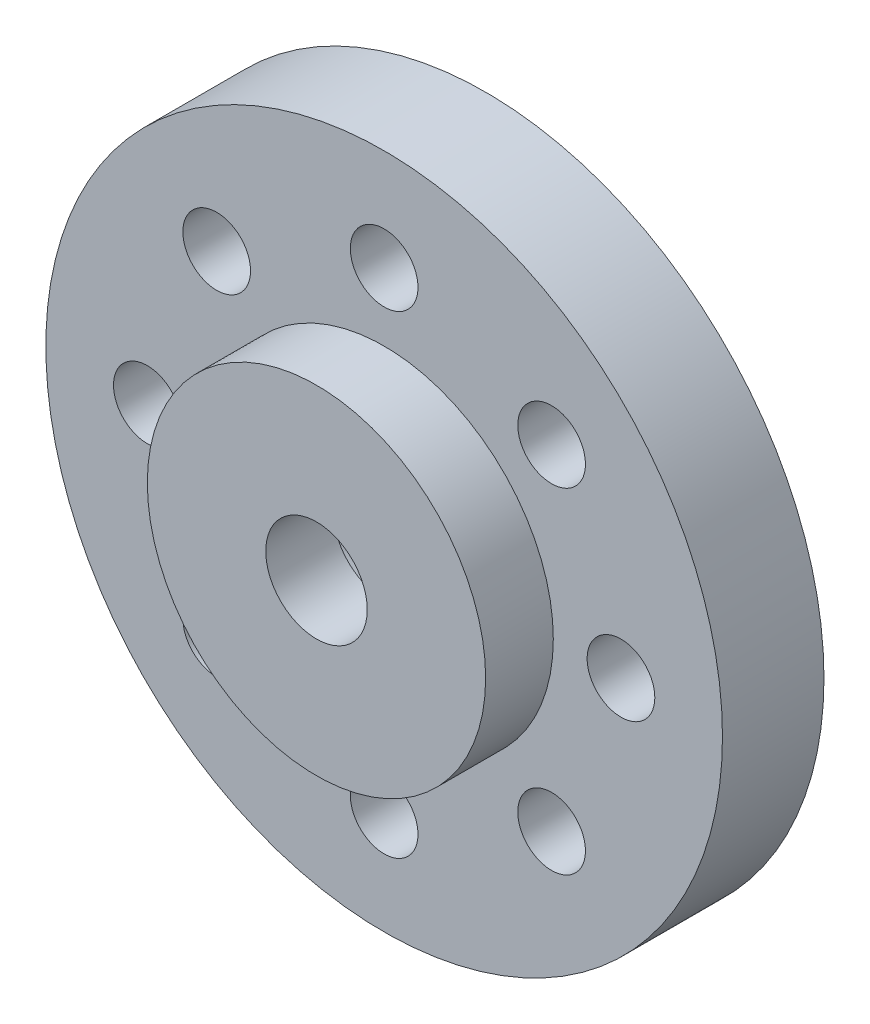
ISO-10303-21;
HEADER;
FILE_DESCRIPTION(('STEP AP214'),'2;1');
FILE_NAME('part.step','',(''),(''),'','','');
FILE_SCHEMA(('AUTOMOTIVE_DESIGN { 1 0 10303 214 1 1 1 1 }'));
ENDSEC;
DATA;
#1=APPLICATION_CONTEXT('core data for automotive mechanical design processes');
#2=APPLICATION_PROTOCOL_DEFINITION('international standard','automotive_design',2000,#1);
#3=PRODUCT_CONTEXT('',#1,'mechanical');
#4=PRODUCT('Part','Part','',(#3));
#5=PRODUCT_RELATED_PRODUCT_CATEGORY('part','',(#4));
#6=PRODUCT_DEFINITION_FORMATION('','',#4);
#7=PRODUCT_DEFINITION_CONTEXT('part definition',#1,'design');
#8=PRODUCT_DEFINITION('design','',#6,#7);
#9=PRODUCT_DEFINITION_SHAPE('','',#8);
#10=(LENGTH_UNIT() NAMED_UNIT(*) SI_UNIT(.MILLI.,.METRE.));
#11=(NAMED_UNIT(*) PLANE_ANGLE_UNIT() SI_UNIT($,.RADIAN.));
#12=(NAMED_UNIT(*) SI_UNIT($,.STERADIAN.) SOLID_ANGLE_UNIT());
#13=UNCERTAINTY_MEASURE_WITH_UNIT(LENGTH_MEASURE(1.E-05),#10,'distance_accuracy_value','');
#14=(GEOMETRIC_REPRESENTATION_CONTEXT(3) GLOBAL_UNCERTAINTY_ASSIGNED_CONTEXT((#13)) GLOBAL_UNIT_ASSIGNED_CONTEXT((#10,
#11,#12)) REPRESENTATION_CONTEXT('',''));
#15=CARTESIAN_POINT('',(0.,0.,0.));
#16=DIRECTION('',(0.,0.,1.));
#17=DIRECTION('',(1.,0.,0.));
#18=AXIS2_PLACEMENT_3D('',#15,#16,#17);
#19=CARTESIAN_POINT('',(0.,0.,3.));
#20=DIRECTION('',(0.,0.,1.));
#21=DIRECTION('',(1.,0.,0.));
#22=AXIS2_PLACEMENT_3D('',#19,#20,#21);
#23=PLANE('',#22);
#24=CARTESIAN_POINT('',(0.,0.,3.));
#25=DIRECTION('',(0.,0.,1.));
#26=DIRECTION('',(1.,0.,0.));
#27=AXIS2_PLACEMENT_3D('',#24,#25,#26);
#28=CIRCLE('',#27,5.);
#29=CARTESIAN_POINT('',(5.,0.,3.));
#30=VERTEX_POINT('',#29);
#31=EDGE_CURVE('E126',#30,#30,#28,.T.);
#32=ORIENTED_EDGE('',*,*,#31,.F.);
#33=EDGE_LOOP('',(#32));
#34=FACE_BOUND('',#33,.T.);
#35=CARTESIAN_POINT('',(0.,7.,3.));
#36=DIRECTION('',(0.,0.,1.));
#37=DIRECTION('',(1.,0.,0.));
#38=AXIS2_PLACEMENT_3D('',#35,#36,#37);
#39=CIRCLE('',#38,1.);
#40=CARTESIAN_POINT('',(1.00000000000007,7.,3.));
#41=VERTEX_POINT('',#40);
#42=EDGE_CURVE('E102',#41,#41,#39,.T.);
#43=ORIENTED_EDGE('',*,*,#42,.F.);
#44=EDGE_LOOP('',(#43));
#45=FACE_BOUND('',#44,.T.);
#46=CARTESIAN_POINT('',(-7.,0.,3.));
#47=DIRECTION('',(0.,0.,1.));
#48=DIRECTION('',(1.,0.,0.));
#49=AXIS2_PLACEMENT_3D('',#46,#47,#48);
#50=CIRCLE('',#49,1.);
#51=CARTESIAN_POINT('',(-6.,0.,3.));
#52=VERTEX_POINT('',#51);
#53=EDGE_CURVE('E86',#52,#52,#50,.T.);
#54=ORIENTED_EDGE('',*,*,#53,.F.);
#55=EDGE_LOOP('',(#54));
#56=FACE_BOUND('',#55,.T.);
#57=CARTESIAN_POINT('',(0.,-7.,3.));
#58=DIRECTION('',(0.,0.,1.));
#59=DIRECTION('',(1.,0.,0.));
#60=AXIS2_PLACEMENT_3D('',#57,#58,#59);
#61=CIRCLE('',#60,1.);
#62=CARTESIAN_POINT('',(0.999999999999977,-7.,3.));
#63=VERTEX_POINT('',#62);
#64=EDGE_CURVE('E70',#63,#63,#61,.T.);
#65=ORIENTED_EDGE('',*,*,#64,.F.);
#66=EDGE_LOOP('',(#65));
#67=FACE_BOUND('',#66,.T.);
#68=CARTESIAN_POINT('',(7.,0.,3.));
#69=DIRECTION('',(0.,0.,1.));
#70=DIRECTION('',(1.,0.,0.));
#71=AXIS2_PLACEMENT_3D('',#68,#69,#70);
#72=CIRCLE('',#71,1.);
#73=CARTESIAN_POINT('',(8.,0.,3.));
#74=VERTEX_POINT('',#73);
#75=EDGE_CURVE('E57',#74,#74,#72,.T.);
#76=ORIENTED_EDGE('',*,*,#75,.F.);
#77=EDGE_LOOP('',(#76));
#78=FACE_BOUND('',#77,.T.);
#79=CARTESIAN_POINT('',(0.,0.,3.));
#80=DIRECTION('',(0.,0.,1.));
#81=DIRECTION('',(1.,0.,0.));
#82=AXIS2_PLACEMENT_3D('',#79,#80,#81);
#83=CIRCLE('',#82,10.);
#84=CARTESIAN_POINT('',(10.,0.,3.));
#85=VERTEX_POINT('',#84);
#86=EDGE_CURVE('E10',#85,#85,#83,.T.);
#87=ORIENTED_EDGE('',*,*,#86,.T.);
#88=EDGE_LOOP('',(#87));
#89=FACE_BOUND('',#88,.T.);
#90=CARTESIAN_POINT('',(4.94974746830583,-4.94974746830584,3.));
#91=DIRECTION('',(0.,0.,1.));
#92=DIRECTION('',(1.,0.,0.));
#93=AXIS2_PLACEMENT_3D('',#90,#91,#92);
#94=CIRCLE('',#93,1.);
#95=CARTESIAN_POINT('',(5.94974746830583,-4.94974746830584,3.));
#96=VERTEX_POINT('',#95);
#97=EDGE_CURVE('E62',#96,#96,#94,.T.);
#98=ORIENTED_EDGE('',*,*,#97,.F.);
#99=EDGE_LOOP('',(#98));
#100=FACE_BOUND('',#99,.T.);
#101=CARTESIAN_POINT('',(-4.94974746830586,-4.94974746830581,3.));
#102=DIRECTION('',(0.,0.,1.));
#103=DIRECTION('',(1.,0.,0.));
#104=AXIS2_PLACEMENT_3D('',#101,#102,#103);
#105=CIRCLE('',#104,1.);
#106=CARTESIAN_POINT('',(-3.94974746830586,-4.94974746830581,3.));
#107=VERTEX_POINT('',#106);
#108=EDGE_CURVE('E78',#107,#107,#105,.T.);
#109=ORIENTED_EDGE('',*,*,#108,.F.);
#110=EDGE_LOOP('',(#109));
#111=FACE_BOUND('',#110,.T.);
#112=CARTESIAN_POINT('',(-4.94974746830579,4.94974746830588,3.));
#113=DIRECTION('',(0.,0.,1.));
#114=DIRECTION('',(1.,0.,0.));
#115=AXIS2_PLACEMENT_3D('',#112,#113,#114);
#116=CIRCLE('',#115,1.);
#117=CARTESIAN_POINT('',(-3.94974746830579,4.94974746830588,3.));
#118=VERTEX_POINT('',#117);
#119=EDGE_CURVE('E94',#118,#118,#116,.T.);
#120=ORIENTED_EDGE('',*,*,#119,.F.);
#121=EDGE_LOOP('',(#120));
#122=FACE_BOUND('',#121,.T.);
#123=CARTESIAN_POINT('',(4.94974746830589,4.94974746830577,3.));
#124=DIRECTION('',(0.,0.,1.));
#125=DIRECTION('',(1.,0.,0.));
#126=AXIS2_PLACEMENT_3D('',#123,#124,#125);
#127=CIRCLE('',#126,1.);
#128=CARTESIAN_POINT('',(5.94974746830589,4.94974746830577,3.));
#129=VERTEX_POINT('',#128);
#130=EDGE_CURVE('E110',#129,#129,#127,.T.);
#131=ORIENTED_EDGE('',*,*,#130,.F.);
#132=EDGE_LOOP('',(#131));
#133=FACE_BOUND('',#132,.T.);
#134=ADVANCED_FACE('F39',(#34,#45,#56,#67,#78,#89,#100,#111,#122,#133),#23,.T.);
#135=CARTESIAN_POINT('',(0.,0.,0.));
#136=DIRECTION('',(0.,0.,1.));
#137=DIRECTION('',(1.,0.,0.));
#138=AXIS2_PLACEMENT_3D('',#135,#136,#137);
#139=PLANE('',#138);
#140=CARTESIAN_POINT('',(0.,0.,0.));
#141=DIRECTION('',(0.,0.,1.));
#142=DIRECTION('',(1.,0.,0.));
#143=AXIS2_PLACEMENT_3D('',#140,#141,#142);
#144=CIRCLE('',#143,10.);
#145=CARTESIAN_POINT('',(10.,0.,0.));
#146=VERTEX_POINT('',#145);
#147=EDGE_CURVE('E43',#146,#146,#144,.T.);
#148=ORIENTED_EDGE('',*,*,#147,.F.);
#149=EDGE_LOOP('',(#148));
#150=FACE_BOUND('',#149,.T.);
#151=CARTESIAN_POINT('',(0.,0.,0.));
#152=DIRECTION('',(0.,0.,1.));
#153=DIRECTION('',(1.,0.,0.));
#154=AXIS2_PLACEMENT_3D('',#151,#152,#153);
#155=CIRCLE('',#154,3.);
#156=CARTESIAN_POINT('',(3.,0.,0.));
#157=VERTEX_POINT('',#156);
#158=EDGE_CURVE('E52',#157,#157,#155,.T.);
#159=ORIENTED_EDGE('',*,*,#158,.T.);
#160=EDGE_LOOP('',(#159));
#161=FACE_BOUND('',#160,.T.);
#162=CARTESIAN_POINT('',(7.,0.,0.));
#163=DIRECTION('',(0.,0.,1.));
#164=DIRECTION('',(1.,0.,0.));
#165=AXIS2_PLACEMENT_3D('',#162,#163,#164);
#166=CIRCLE('',#165,1.);
#167=CARTESIAN_POINT('',(8.,0.,0.));
#168=VERTEX_POINT('',#167);
#169=EDGE_CURVE('E58',#168,#168,#166,.T.);
#170=ORIENTED_EDGE('',*,*,#169,.T.);
#171=EDGE_LOOP('',(#170));
#172=FACE_BOUND('',#171,.T.);
#173=CARTESIAN_POINT('',(4.94974746830583,-4.94974746830584,0.));
#174=DIRECTION('',(0.,0.,1.));
#175=DIRECTION('',(1.,0.,0.));
#176=AXIS2_PLACEMENT_3D('',#173,#174,#175);
#177=CIRCLE('',#176,1.);
#178=CARTESIAN_POINT('',(5.94974746830583,-4.94974746830584,0.));
#179=VERTEX_POINT('',#178);
#180=EDGE_CURVE('E66',#179,#179,#177,.T.);
#181=ORIENTED_EDGE('',*,*,#180,.T.);
#182=EDGE_LOOP('',(#181));
#183=FACE_BOUND('',#182,.T.);
#184=CARTESIAN_POINT('',(0.,-7.,0.));
#185=DIRECTION('',(0.,0.,1.));
#186=DIRECTION('',(1.,0.,0.));
#187=AXIS2_PLACEMENT_3D('',#184,#185,#186);
#188=CIRCLE('',#187,1.);
#189=CARTESIAN_POINT('',(0.999999999999977,-7.,0.));
#190=VERTEX_POINT('',#189);
#191=EDGE_CURVE('E74',#190,#190,#188,.T.);
#192=ORIENTED_EDGE('',*,*,#191,.T.);
#193=EDGE_LOOP('',(#192));
#194=FACE_BOUND('',#193,.T.);
#195=CARTESIAN_POINT('',(-4.94974746830586,-4.94974746830581,0.));
#196=DIRECTION('',(0.,0.,1.));
#197=DIRECTION('',(1.,0.,0.));
#198=AXIS2_PLACEMENT_3D('',#195,#196,#197);
#199=CIRCLE('',#198,1.);
#200=CARTESIAN_POINT('',(-3.94974746830586,-4.94974746830581,0.));
#201=VERTEX_POINT('',#200);
#202=EDGE_CURVE('E82',#201,#201,#199,.T.);
#203=ORIENTED_EDGE('',*,*,#202,.T.);
#204=EDGE_LOOP('',(#203));
#205=FACE_BOUND('',#204,.T.);
#206=CARTESIAN_POINT('',(-7.,0.,0.));
#207=DIRECTION('',(0.,0.,1.));
#208=DIRECTION('',(1.,0.,0.));
#209=AXIS2_PLACEMENT_3D('',#206,#207,#208);
#210=CIRCLE('',#209,1.);
#211=CARTESIAN_POINT('',(-6.,0.,0.));
#212=VERTEX_POINT('',#211);
#213=EDGE_CURVE('E90',#212,#212,#210,.T.);
#214=ORIENTED_EDGE('',*,*,#213,.T.);
#215=EDGE_LOOP('',(#214));
#216=FACE_BOUND('',#215,.T.);
#217=CARTESIAN_POINT('',(-4.94974746830579,4.94974746830588,0.));
#218=DIRECTION('',(0.,0.,1.));
#219=DIRECTION('',(1.,0.,0.));
#220=AXIS2_PLACEMENT_3D('',#217,#218,#219);
#221=CIRCLE('',#220,1.);
#222=CARTESIAN_POINT('',(-3.94974746830579,4.94974746830588,0.));
#223=VERTEX_POINT('',#222);
#224=EDGE_CURVE('E98',#223,#223,#221,.T.);
#225=ORIENTED_EDGE('',*,*,#224,.T.);
#226=EDGE_LOOP('',(#225));
#227=FACE_BOUND('',#226,.T.);
#228=CARTESIAN_POINT('',(0.,7.,0.));
#229=DIRECTION('',(0.,0.,1.));
#230=DIRECTION('',(1.,0.,0.));
#231=AXIS2_PLACEMENT_3D('',#228,#229,#230);
#232=CIRCLE('',#231,1.);
#233=CARTESIAN_POINT('',(1.00000000000007,7.,0.));
#234=VERTEX_POINT('',#233);
#235=EDGE_CURVE('E106',#234,#234,#232,.T.);
#236=ORIENTED_EDGE('',*,*,#235,.T.);
#237=EDGE_LOOP('',(#236));
#238=FACE_BOUND('',#237,.T.);
#239=CARTESIAN_POINT('',(4.94974746830589,4.94974746830577,0.));
#240=DIRECTION('',(0.,0.,1.));
#241=DIRECTION('',(1.,0.,0.));
#242=AXIS2_PLACEMENT_3D('',#239,#240,#241);
#243=CIRCLE('',#242,1.);
#244=CARTESIAN_POINT('',(5.94974746830589,4.94974746830577,0.));
#245=VERTEX_POINT('',#244);
#246=EDGE_CURVE('E114',#245,#245,#243,.T.);
#247=ORIENTED_EDGE('',*,*,#246,.T.);
#248=EDGE_LOOP('',(#247));
#249=FACE_BOUND('',#248,.T.);
#250=ADVANCED_FACE('F162',(#150,#161,#172,#183,#194,#205,#216,#227,#238,#249),#139,.F.);
#251=CARTESIAN_POINT('',(0.,0.,3.));
#252=DIRECTION('',(0.,0.,-1.));
#253=DIRECTION('',(-1.,0.,0.));
#254=AXIS2_PLACEMENT_3D('',#251,#252,#253);
#255=CYLINDRICAL_SURFACE('',#254,10.);
#256=ORIENTED_EDGE('',*,*,#86,.F.);
#257=EDGE_LOOP('',(#256));
#258=FACE_BOUND('',#257,.T.);
#259=ORIENTED_EDGE('',*,*,#147,.T.);
#260=EDGE_LOOP('',(#259));
#261=FACE_BOUND('',#260,.T.);
#262=ADVANCED_FACE('F41',(#258,#261),#255,.T.);
#263=CARTESIAN_POINT('',(0.,0.,3.));
#264=DIRECTION('',(0.,0.,-1.));
#265=DIRECTION('',(-1.,0.,0.));
#266=AXIS2_PLACEMENT_3D('',#263,#264,#265);
#267=CYLINDRICAL_SURFACE('',#266,3.);
#268=CARTESIAN_POINT('',(0.,0.,3.));
#269=DIRECTION('',(0.,0.,1.));
#270=DIRECTION('',(1.,0.,0.));
#271=AXIS2_PLACEMENT_3D('',#268,#269,#270);
#272=CIRCLE('',#271,3.);
#273=CARTESIAN_POINT('',(3.,0.,3.));
#274=VERTEX_POINT('',#273);
#275=EDGE_CURVE('E118',#274,#274,#272,.T.);
#276=ORIENTED_EDGE('',*,*,#275,.T.);
#277=EDGE_LOOP('',(#276));
#278=FACE_BOUND('',#277,.T.);
#279=ORIENTED_EDGE('',*,*,#158,.F.);
#280=EDGE_LOOP('',(#279));
#281=FACE_BOUND('',#280,.T.);
#282=ADVANCED_FACE('F172',(#278,#281),#267,.F.);
#283=CARTESIAN_POINT('',(7.,0.,3.));
#284=DIRECTION('',(0.,0.,-1.));
#285=DIRECTION('',(-1.,0.,0.));
#286=AXIS2_PLACEMENT_3D('',#283,#284,#285);
#287=CYLINDRICAL_SURFACE('',#286,1.);
#288=ORIENTED_EDGE('',*,*,#75,.T.);
#289=EDGE_LOOP('',(#288));
#290=FACE_BOUND('',#289,.T.);
#291=ORIENTED_EDGE('',*,*,#169,.F.);
#292=EDGE_LOOP('',(#291));
#293=FACE_BOUND('',#292,.T.);
#294=ADVANCED_FACE('F175',(#290,#293),#287,.F.);
#295=CARTESIAN_POINT('',(4.94974746830583,-4.94974746830584,3.));
#296=DIRECTION('',(0.,0.,-1.));
#297=DIRECTION('',(-1.,0.,0.));
#298=AXIS2_PLACEMENT_3D('',#295,#296,#297);
#299=CYLINDRICAL_SURFACE('',#298,1.);
#300=ORIENTED_EDGE('',*,*,#97,.T.);
#301=EDGE_LOOP('',(#300));
#302=FACE_BOUND('',#301,.T.);
#303=ORIENTED_EDGE('',*,*,#180,.F.);
#304=EDGE_LOOP('',(#303));
#305=FACE_BOUND('',#304,.T.);
#306=ADVANCED_FACE('F179',(#302,#305),#299,.F.);
#307=CARTESIAN_POINT('',(0.,-7.,3.));
#308=DIRECTION('',(0.,0.,-1.));
#309=DIRECTION('',(-1.,0.,0.));
#310=AXIS2_PLACEMENT_3D('',#307,#308,#309);
#311=CYLINDRICAL_SURFACE('',#310,1.);
#312=ORIENTED_EDGE('',*,*,#64,.T.);
#313=EDGE_LOOP('',(#312));
#314=FACE_BOUND('',#313,.T.);
#315=ORIENTED_EDGE('',*,*,#191,.F.);
#316=EDGE_LOOP('',(#315));
#317=FACE_BOUND('',#316,.T.);
#318=ADVANCED_FACE('F183',(#314,#317),#311,.F.);
#319=CARTESIAN_POINT('',(-4.94974746830586,-4.94974746830581,3.));
#320=DIRECTION('',(0.,0.,-1.));
#321=DIRECTION('',(-1.,0.,0.));
#322=AXIS2_PLACEMENT_3D('',#319,#320,#321);
#323=CYLINDRICAL_SURFACE('',#322,1.);
#324=ORIENTED_EDGE('',*,*,#108,.T.);
#325=EDGE_LOOP('',(#324));
#326=FACE_BOUND('',#325,.T.);
#327=ORIENTED_EDGE('',*,*,#202,.F.);
#328=EDGE_LOOP('',(#327));
#329=FACE_BOUND('',#328,.T.);
#330=ADVANCED_FACE('F187',(#326,#329),#323,.F.);
#331=CARTESIAN_POINT('',(-7.,0.,3.));
#332=DIRECTION('',(0.,0.,-1.));
#333=DIRECTION('',(-1.,0.,0.));
#334=AXIS2_PLACEMENT_3D('',#331,#332,#333);
#335=CYLINDRICAL_SURFACE('',#334,1.);
#336=ORIENTED_EDGE('',*,*,#53,.T.);
#337=EDGE_LOOP('',(#336));
#338=FACE_BOUND('',#337,.T.);
#339=ORIENTED_EDGE('',*,*,#213,.F.);
#340=EDGE_LOOP('',(#339));
#341=FACE_BOUND('',#340,.T.);
#342=ADVANCED_FACE('F191',(#338,#341),#335,.F.);
#343=CARTESIAN_POINT('',(-4.94974746830579,4.94974746830588,3.));
#344=DIRECTION('',(0.,0.,-1.));
#345=DIRECTION('',(-1.,0.,0.));
#346=AXIS2_PLACEMENT_3D('',#343,#344,#345);
#347=CYLINDRICAL_SURFACE('',#346,1.);
#348=ORIENTED_EDGE('',*,*,#119,.T.);
#349=EDGE_LOOP('',(#348));
#350=FACE_BOUND('',#349,.T.);
#351=ORIENTED_EDGE('',*,*,#224,.F.);
#352=EDGE_LOOP('',(#351));
#353=FACE_BOUND('',#352,.T.);
#354=ADVANCED_FACE('F195',(#350,#353),#347,.F.);
#355=CARTESIAN_POINT('',(0.,7.,3.));
#356=DIRECTION('',(0.,0.,-1.));
#357=DIRECTION('',(-1.,0.,0.));
#358=AXIS2_PLACEMENT_3D('',#355,#356,#357);
#359=CYLINDRICAL_SURFACE('',#358,1.);
#360=ORIENTED_EDGE('',*,*,#42,.T.);
#361=EDGE_LOOP('',(#360));
#362=FACE_BOUND('',#361,.T.);
#363=ORIENTED_EDGE('',*,*,#235,.F.);
#364=EDGE_LOOP('',(#363));
#365=FACE_BOUND('',#364,.T.);
#366=ADVANCED_FACE('F199',(#362,#365),#359,.F.);
#367=CARTESIAN_POINT('',(4.94974746830589,4.94974746830577,3.));
#368=DIRECTION('',(0.,0.,-1.));
#369=DIRECTION('',(-1.,0.,0.));
#370=AXIS2_PLACEMENT_3D('',#367,#368,#369);
#371=CYLINDRICAL_SURFACE('',#370,1.);
#372=ORIENTED_EDGE('',*,*,#130,.T.);
#373=EDGE_LOOP('',(#372));
#374=FACE_BOUND('',#373,.T.);
#375=ORIENTED_EDGE('',*,*,#246,.F.);
#376=EDGE_LOOP('',(#375));
#377=FACE_BOUND('',#376,.T.);
#378=ADVANCED_FACE('F157',(#374,#377),#371,.F.);
#379=CARTESIAN_POINT('',(0.,0.,3.));
#380=DIRECTION('',(0.,0.,1.));
#381=DIRECTION('',(1.,0.,0.));
#382=AXIS2_PLACEMENT_3D('',#379,#380,#381);
#383=PLANE('',#382);
#384=CARTESIAN_POINT('',(0.,0.,3.));
#385=DIRECTION('',(0.,0.,1.));
#386=DIRECTION('',(1.,0.,0.));
#387=AXIS2_PLACEMENT_3D('',#384,#385,#386);
#388=CIRCLE('',#387,1.5);
#389=CARTESIAN_POINT('',(1.5,0.,3.));
#390=VERTEX_POINT('',#389);
#391=EDGE_CURVE('E134',#390,#390,#388,.T.);
#392=ORIENTED_EDGE('',*,*,#391,.T.);
#393=EDGE_LOOP('',(#392));
#394=FACE_BOUND('',#393,.T.);
#395=ORIENTED_EDGE('',*,*,#275,.F.);
#396=EDGE_LOOP('',(#395));
#397=FACE_BOUND('',#396,.T.);
#398=ADVANCED_FACE('F148',(#394,#397),#383,.F.);
#399=CARTESIAN_POINT('',(0.,0.,5.));
#400=DIRECTION('',(0.,0.,1.));
#401=DIRECTION('',(1.,0.,0.));
#402=AXIS2_PLACEMENT_3D('',#399,#400,#401);
#403=PLANE('',#402);
#404=CARTESIAN_POINT('',(0.,0.,5.));
#405=DIRECTION('',(0.,0.,1.));
#406=DIRECTION('',(1.,0.,0.));
#407=AXIS2_PLACEMENT_3D('',#404,#405,#406);
#408=CIRCLE('',#407,5.);
#409=CARTESIAN_POINT('',(5.,0.,5.));
#410=VERTEX_POINT('',#409);
#411=EDGE_CURVE('E125',#410,#410,#408,.T.);
#412=ORIENTED_EDGE('',*,*,#411,.T.);
#413=EDGE_LOOP('',(#412));
#414=FACE_BOUND('',#413,.T.);
#415=CARTESIAN_POINT('',(0.,0.,5.));
#416=DIRECTION('',(0.,0.,1.));
#417=DIRECTION('',(1.,0.,0.));
#418=AXIS2_PLACEMENT_3D('',#415,#416,#417);
#419=CIRCLE('',#418,1.5);
#420=CARTESIAN_POINT('',(1.5,0.,5.));
#421=VERTEX_POINT('',#420);
#422=EDGE_CURVE('E130',#421,#421,#419,.T.);
#423=ORIENTED_EDGE('',*,*,#422,.F.);
#424=EDGE_LOOP('',(#423));
#425=FACE_BOUND('',#424,.T.);
#426=ADVANCED_FACE('F145',(#414,#425),#403,.T.);
#427=CARTESIAN_POINT('',(0.,0.,5.));
#428=DIRECTION('',(0.,0.,-1.));
#429=DIRECTION('',(-1.,0.,0.));
#430=AXIS2_PLACEMENT_3D('',#427,#428,#429);
#431=CYLINDRICAL_SURFACE('',#430,5.);
#432=ORIENTED_EDGE('',*,*,#411,.F.);
#433=EDGE_LOOP('',(#432));
#434=FACE_BOUND('',#433,.T.);
#435=ORIENTED_EDGE('',*,*,#31,.T.);
#436=EDGE_LOOP('',(#435));
#437=FACE_BOUND('',#436,.T.);
#438=ADVANCED_FACE('F147',(#434,#437),#431,.T.);
#439=CARTESIAN_POINT('',(0.,0.,5.));
#440=DIRECTION('',(0.,0.,-1.));
#441=DIRECTION('',(-1.,0.,0.));
#442=AXIS2_PLACEMENT_3D('',#439,#440,#441);
#443=CYLINDRICAL_SURFACE('',#442,1.5);
#444=ORIENTED_EDGE('',*,*,#422,.T.);
#445=EDGE_LOOP('',(#444));
#446=FACE_BOUND('',#445,.T.);
#447=ORIENTED_EDGE('',*,*,#391,.F.);
#448=EDGE_LOOP('',(#447));
#449=FACE_BOUND('',#448,.T.);
#450=ADVANCED_FACE('F142',(#446,#449),#443,.F.);
#451=CLOSED_SHELL('',(#134,#250,#262,#282,#294,#306,#318,#330,#342,#354,#366,#378,#398,#426,
#438,#450));
#452=MANIFOLD_SOLID_BREP('B2',#451);
#453=ADVANCED_BREP_SHAPE_REPRESENTATION('',(#18,#452),#14);
#454=SHAPE_DEFINITION_REPRESENTATION(#9,#453);
ENDSEC;
END-ISO-10303-21;
